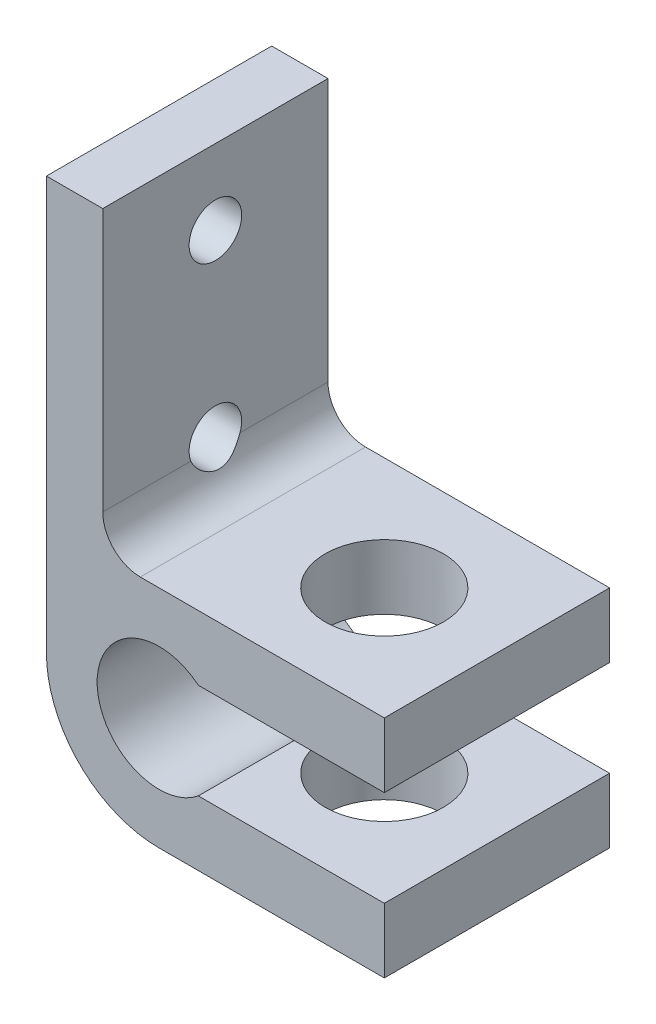
ISO-10303-21;
HEADER;
FILE_DESCRIPTION(('STEP AP214'),'2;1');
FILE_NAME('part.step','',(''),(''),'','','');
FILE_SCHEMA(('AUTOMOTIVE_DESIGN { 1 0 10303 214 1 1 1 1 }'));
ENDSEC;
DATA;
#1=APPLICATION_CONTEXT('core data for automotive mechanical design processes');
#2=APPLICATION_PROTOCOL_DEFINITION('international standard','automotive_design',2000,#1);
#3=PRODUCT_CONTEXT('',#1,'mechanical');
#4=PRODUCT('Part','Part','',(#3));
#5=PRODUCT_RELATED_PRODUCT_CATEGORY('part','',(#4));
#6=PRODUCT_DEFINITION_FORMATION('','',#4);
#7=PRODUCT_DEFINITION_CONTEXT('part definition',#1,'design');
#8=PRODUCT_DEFINITION('design','',#6,#7);
#9=PRODUCT_DEFINITION_SHAPE('','',#8);
#10=(LENGTH_UNIT() NAMED_UNIT(*) SI_UNIT(.MILLI.,.METRE.));
#11=(NAMED_UNIT(*) PLANE_ANGLE_UNIT() SI_UNIT($,.RADIAN.));
#12=(NAMED_UNIT(*) SI_UNIT($,.STERADIAN.) SOLID_ANGLE_UNIT());
#13=UNCERTAINTY_MEASURE_WITH_UNIT(LENGTH_MEASURE(1.E-05),#10,'distance_accuracy_value','');
#14=(GEOMETRIC_REPRESENTATION_CONTEXT(3) GLOBAL_UNCERTAINTY_ASSIGNED_CONTEXT((#13)) GLOBAL_UNIT_ASSIGNED_CONTEXT((#10,
#11,#12)) REPRESENTATION_CONTEXT('',''));
#15=CARTESIAN_POINT('',(0.,0.,0.));
#16=DIRECTION('',(0.,0.,1.));
#17=DIRECTION('',(1.,0.,0.));
#18=AXIS2_PLACEMENT_3D('',#15,#16,#17);
#19=CARTESIAN_POINT('',(0.,0.,12.));
#20=DIRECTION('',(0.,0.,-1.));
#21=DIRECTION('',(-1.,0.,0.));
#22=AXIS2_PLACEMENT_3D('',#19,#20,#21);
#23=CYLINDRICAL_SURFACE('',#22,3.3);
#24=CARTESIAN_POINT('',(0.,0.,0.));
#25=DIRECTION('',(0.,0.,-1.));
#26=DIRECTION('',(1.,0.,0.));
#27=AXIS2_PLACEMENT_3D('',#24,#25,#26);
#28=CIRCLE('',#27,3.3);
#29=CARTESIAN_POINT('',(2.09133180710731,-2.55271057360235,0.));
#30=VERTEX_POINT('',#29);
#31=CARTESIAN_POINT('',(2.09133180710731,2.55271057360235,0.));
#32=VERTEX_POINT('',#31);
#33=EDGE_CURVE('E161',#30,#32,#28,.T.);
#34=ORIENTED_EDGE('',*,*,#33,.T.);
#35=DIRECTION('',(0.,0.,-1.));
#36=VECTOR('',#35,1.);
#37=CARTESIAN_POINT('',(2.09133180710731,2.55271057360235,12.));
#38=LINE('',#37,#36);
#39=CARTESIAN_POINT('',(2.09133180710731,2.55271057360235,12.));
#40=VERTEX_POINT('',#39);
#41=EDGE_CURVE('E11',#40,#32,#38,.T.);
#42=ORIENTED_EDGE('',*,*,#41,.F.);
#43=CARTESIAN_POINT('',(0.,0.,12.));
#44=DIRECTION('',(0.,0.,-1.));
#45=DIRECTION('',(1.,0.,0.));
#46=AXIS2_PLACEMENT_3D('',#43,#44,#45);
#47=CIRCLE('',#46,3.3);
#48=CARTESIAN_POINT('',(2.09133180710731,-2.55271057360235,12.));
#49=VERTEX_POINT('',#48);
#50=EDGE_CURVE('E186',#49,#40,#47,.T.);
#51=ORIENTED_EDGE('',*,*,#50,.F.);
#52=DIRECTION('',(0.,0.,-1.));
#53=VECTOR('',#52,1.);
#54=CARTESIAN_POINT('',(2.09133180710731,-2.55271057360235,12.));
#55=LINE('',#54,#53);
#56=EDGE_CURVE('E157',#49,#30,#55,.T.);
#57=ORIENTED_EDGE('',*,*,#56,.T.);
#58=EDGE_LOOP('',(#34,#42,#51,#57));
#59=FACE_BOUND('',#58,.T.);
#60=ADVANCED_FACE('F31',(#59),#23,.F.);
#61=CARTESIAN_POINT('',(12.,2.55271057360236,12.));
#62=DIRECTION('',(0.,1.,0.));
#63=DIRECTION('',(-1.,0.,0.));
#64=AXIS2_PLACEMENT_3D('',#61,#62,#63);
#65=PLANE('',#64);
#66=CARTESIAN_POINT('',(6.,2.55271057360235,6.));
#67=DIRECTION('',(0.,1.,0.));
#68=DIRECTION('',(-1.,0.,0.));
#69=AXIS2_PLACEMENT_3D('',#66,#67,#68);
#70=CIRCLE('',#69,3.15);
#71=CARTESIAN_POINT('',(2.85,2.55271057360235,6.));
#72=VERTEX_POINT('',#71);
#73=EDGE_CURVE('E165',#72,#72,#70,.T.);
#74=ORIENTED_EDGE('',*,*,#73,.T.);
#75=EDGE_LOOP('',(#74));
#76=FACE_BOUND('',#75,.T.);
#77=DIRECTION('',(1.,0.,0.));
#78=VECTOR('',#77,1.);
#79=CARTESIAN_POINT('',(12.,2.55271057360236,0.));
#80=LINE('',#79,#78);
#81=CARTESIAN_POINT('',(12.,2.55271057360236,0.));
#82=VERTEX_POINT('',#81);
#83=EDGE_CURVE('E164',#32,#82,#80,.T.);
#84=ORIENTED_EDGE('',*,*,#83,.T.);
#85=DIRECTION('',(0.,0.,-1.));
#86=VECTOR('',#85,1.);
#87=CARTESIAN_POINT('',(12.,2.55271057360236,12.));
#88=LINE('',#87,#86);
#89=CARTESIAN_POINT('',(12.,2.55271057360236,12.));
#90=VERTEX_POINT('',#89);
#91=EDGE_CURVE('E39',#90,#82,#88,.T.);
#92=ORIENTED_EDGE('',*,*,#91,.F.);
#93=DIRECTION('',(1.,0.,0.));
#94=VECTOR('',#93,1.);
#95=CARTESIAN_POINT('',(12.,2.55271057360236,12.));
#96=LINE('',#95,#94);
#97=EDGE_CURVE('E107',#40,#90,#96,.T.);
#98=ORIENTED_EDGE('',*,*,#97,.F.);
#99=ORIENTED_EDGE('',*,*,#41,.T.);
#100=EDGE_LOOP('',(#84,#92,#98,#99));
#101=FACE_BOUND('',#100,.T.);
#102=ADVANCED_FACE('F328',(#76,#101),#65,.F.);
#103=CARTESIAN_POINT('',(12.,6.,12.));
#104=DIRECTION('',(-1.,0.,0.));
#105=DIRECTION('',(0.,0.,1.));
#106=AXIS2_PLACEMENT_3D('',#103,#104,#105);
#107=PLANE('',#106);
#108=DIRECTION('',(0.,1.,0.));
#109=VECTOR('',#108,1.);
#110=CARTESIAN_POINT('',(12.,6.,0.));
#111=LINE('',#110,#109);
#112=CARTESIAN_POINT('',(12.,6.,0.));
#113=VERTEX_POINT('',#112);
#114=EDGE_CURVE('E167',#82,#113,#111,.T.);
#115=ORIENTED_EDGE('',*,*,#114,.T.);
#116=DIRECTION('',(0.,0.,-1.));
#117=VECTOR('',#116,1.);
#118=CARTESIAN_POINT('',(12.,6.,12.));
#119=LINE('',#118,#117);
#120=CARTESIAN_POINT('',(12.,6.,12.));
#121=VERTEX_POINT('',#120);
#122=EDGE_CURVE('E206',#121,#113,#119,.T.);
#123=ORIENTED_EDGE('',*,*,#122,.F.);
#124=DIRECTION('',(0.,1.,0.));
#125=VECTOR('',#124,1.);
#126=CARTESIAN_POINT('',(12.,6.,12.));
#127=LINE('',#126,#125);
#128=EDGE_CURVE('E215',#90,#121,#127,.T.);
#129=ORIENTED_EDGE('',*,*,#128,.F.);
#130=ORIENTED_EDGE('',*,*,#91,.T.);
#131=EDGE_LOOP('',(#115,#123,#129,#130));
#132=FACE_BOUND('',#131,.T.);
#133=ADVANCED_FACE('F213',(#132),#107,.F.);
#134=CARTESIAN_POINT('',(-0.999999999999998,6.,12.));
#135=DIRECTION('',(0.,-1.,0.));
#136=DIRECTION('',(1.,0.,0.));
#137=AXIS2_PLACEMENT_3D('',#134,#135,#136);
#138=PLANE('',#137);
#139=CARTESIAN_POINT('',(6.,6.,6.));
#140=DIRECTION('',(0.,-1.,0.));
#141=DIRECTION('',(1.,0.,0.));
#142=AXIS2_PLACEMENT_3D('',#139,#140,#141);
#143=CIRCLE('',#142,3.15);
#144=CARTESIAN_POINT('',(9.15,6.,6.));
#145=VERTEX_POINT('',#144);
#146=EDGE_CURVE('E262',#145,#145,#143,.T.);
#147=ORIENTED_EDGE('',*,*,#146,.T.);
#148=EDGE_LOOP('',(#147));
#149=FACE_BOUND('',#148,.T.);
#150=DIRECTION('',(-1.,0.,0.));
#151=VECTOR('',#150,1.);
#152=CARTESIAN_POINT('',(-0.999999999999998,6.,0.));
#153=LINE('',#152,#151);
#154=CARTESIAN_POINT('',(-0.999999999999999,6.,0.));
#155=VERTEX_POINT('',#154);
#156=EDGE_CURVE('E169',#113,#155,#153,.T.);
#157=ORIENTED_EDGE('',*,*,#156,.T.);
#158=DIRECTION('',(0.,0.,-1.));
#159=VECTOR('',#158,1.);
#160=CARTESIAN_POINT('',(-0.999999999999999,6.,12.));
#161=LINE('',#160,#159);
#162=CARTESIAN_POINT('',(-0.999999999999999,6.,12.));
#163=VERTEX_POINT('',#162);
#164=EDGE_CURVE('E203',#163,#155,#161,.T.);
#165=ORIENTED_EDGE('',*,*,#164,.F.);
#166=DIRECTION('',(-1.,0.,0.));
#167=VECTOR('',#166,1.);
#168=CARTESIAN_POINT('',(-0.999999999999998,6.,12.));
#169=LINE('',#168,#167);
#170=EDGE_CURVE('E234',#121,#163,#169,.T.);
#171=ORIENTED_EDGE('',*,*,#170,.F.);
#172=ORIENTED_EDGE('',*,*,#122,.T.);
#173=EDGE_LOOP('',(#157,#165,#171,#172));
#174=FACE_BOUND('',#173,.T.);
#175=ADVANCED_FACE('F224',(#149,#174),#138,.F.);
#176=CARTESIAN_POINT('',(-0.999999999999998,8.,12.));
#177=DIRECTION('',(0.,0.,-1.));
#178=DIRECTION('',(-1.,0.,0.));
#179=AXIS2_PLACEMENT_3D('',#176,#177,#178);
#180=CYLINDRICAL_SURFACE('',#179,2.);
#181=DIRECTION('',(0.,0.,-1.));
#182=VECTOR('',#181,1.);
#183=CARTESIAN_POINT('',(-3.,8.,12.));
#184=LINE('',#183,#182);
#185=CARTESIAN_POINT('',(-3.,8.,4.6923303169378));
#186=VERTEX_POINT('',#185);
#187=CARTESIAN_POINT('',(-3.,8.,0.));
#188=VERTEX_POINT('',#187);
#189=EDGE_CURVE('E199',#186,#188,#184,.T.);
#190=ORIENTED_EDGE('',*,*,#189,.F.);
#191=CARTESIAN_POINT('',(-3.,8.,7.3076696830622));
#192=CARTESIAN_POINT('',(-3.00000368626239,7.96493879585205,7.29426672158299));
#193=CARTESIAN_POINT('',(-2.99907757713619,7.93044508794234,7.27945775804309));
#194=CARTESIAN_POINT('',(-2.99557798588428,7.86284995568559,7.2471730323225));
#195=CARTESIAN_POINT('',(-2.99300589707016,7.82974737898662,7.22969953517299));
#196=CARTESIAN_POINT('',(-2.98317564096547,7.73321480469394,7.17368878654337));
#197=CARTESIAN_POINT('',(-2.97379831824372,7.67213074660334,7.13139587112057));
#198=CARTESIAN_POINT('',(-2.95141616063608,7.55800481780882,7.03829992408353));
#199=CARTESIAN_POINT('',(-2.93842158046107,7.50494085733303,6.9875211097939));
#200=CARTESIAN_POINT('',(-2.91087994302873,7.40745729032855,6.87846884707918));
#201=CARTESIAN_POINT('',(-2.89633019489452,7.36305305502016,6.82018237136639));
#202=CARTESIAN_POINT('',(-2.86670218646075,7.2806286863618,6.69236459575695));
#203=CARTESIAN_POINT('',(-2.85167462381524,7.24340242022773,6.62230689286126));
#204=CARTESIAN_POINT('',(-2.82500760353883,7.1811586585015,6.47638067694068));
#205=CARTESIAN_POINT('',(-2.81336560605945,7.15613200119013,6.4005165741272));
#206=CARTESIAN_POINT('',(-2.79595291659767,7.11968134599892,6.24663897729487));
#207=CARTESIAN_POINT('',(-2.79006133620561,7.10797637355411,6.1687068005077));
#208=CARTESIAN_POINT('',(-2.78498144090085,7.09784717637925,6.01178690043574));
#209=CARTESIAN_POINT('',(-2.78578898192442,7.09941474129526,5.93279985987864));
#210=CARTESIAN_POINT('',(-2.79351654379434,7.1149270464979,5.78407009033757));
#211=CARTESIAN_POINT('',(-2.79984460729438,7.12767374943189,5.71416570552736));
#212=CARTESIAN_POINT('',(-2.81671909312502,7.16338885916504,5.57755595111776));
#213=CARTESIAN_POINT('',(-2.82726703375,7.18636094535029,5.51085174261311));
#214=CARTESIAN_POINT('',(-2.85146909517369,7.24300166795964,5.37926862419874));
#215=CARTESIAN_POINT('',(-2.8652372017211,7.27708747588446,5.31459127405056));
#216=CARTESIAN_POINT('',(-2.89352893016537,7.35481999763979,5.19137465916636));
#217=CARTESIAN_POINT('',(-2.90805327032684,7.39847593223179,5.13284139521294));
#218=CARTESIAN_POINT('',(-2.937045702688,7.49914624997917,5.01781917205902));
#219=CARTESIAN_POINT('',(-2.95137596735889,7.55703819461445,4.96205923633939));
#220=CARTESIAN_POINT('',(-2.97557920212588,7.68202604461693,4.86099211838786));
#221=CARTESIAN_POINT('',(-2.9854635984468,7.74909777116661,4.81565828867524));
#222=CARTESIAN_POINT('',(-2.99448188763658,7.8486959988481,4.76027972300955));
#223=CARTESIAN_POINT('',(-2.99651761517117,7.87824657070997,4.74519918785214));
#224=CARTESIAN_POINT('',(-2.99927710982096,7.93838352846184,4.71715708640639));
#225=CARTESIAN_POINT('',(-3.00000128420065,7.96896958980457,4.70419486347597));
#226=CARTESIAN_POINT('',(-3.,8.,4.6923303169378));
#227=B_SPLINE_CURVE_WITH_KNOTS('',3,(#191,#192,#193,#194,#195,#196,#197,#198,#199,#200,#201,
#202,#203,#204,#205,#206,#207,#208,#209,#210,#211,#212,#213,#214,#215,#216,#217,#218,#219,#220,
#221,#222,#223,#224,#225,#226),.UNSPECIFIED.,.F.,.F.,(4,2,2,2,2,2,2,2,2,2,2,2,2,2,2,2,2,4),(0.,
0.112515520213301,0.224935922496968,0.448416625169151,0.671270114793604,0.894515644524399,
1.13560346653734,1.3765099552884,1.61223530135837,1.84781483905723,2.06086455755929,
2.27399099950884,2.4962744309904,2.71877298001379,2.96251937283283,3.20563568809973,
3.3052591882948,3.40485174801758),.UNSPECIFIED.);
#228=CARTESIAN_POINT('',(-3.,8.,7.3076696830622));
#229=VERTEX_POINT('',#228);
#230=EDGE_CURVE('E45',#229,#186,#227,.T.);
#231=ORIENTED_EDGE('',*,*,#230,.F.);
#232=CARTESIAN_POINT('',(-3.,8.,12.));
#233=VERTEX_POINT('',#232);
#234=EDGE_CURVE('E200',#233,#229,#184,.T.);
#235=ORIENTED_EDGE('',*,*,#234,.F.);
#236=CARTESIAN_POINT('',(-0.999999999999998,8.,12.));
#237=DIRECTION('',(0.,0.,-1.));
#238=DIRECTION('',(1.,0.,0.));
#239=AXIS2_PLACEMENT_3D('',#236,#237,#238);
#240=CIRCLE('',#239,2.);
#241=EDGE_CURVE('E231',#163,#233,#240,.T.);
#242=ORIENTED_EDGE('',*,*,#241,.F.);
#243=ORIENTED_EDGE('',*,*,#164,.T.);
#244=CARTESIAN_POINT('',(-0.999999999999998,8.,0.));
#245=DIRECTION('',(0.,0.,-1.));
#246=DIRECTION('',(1.,0.,0.));
#247=AXIS2_PLACEMENT_3D('',#244,#245,#246);
#248=CIRCLE('',#247,2.);
#249=EDGE_CURVE('E171',#155,#188,#248,.T.);
#250=ORIENTED_EDGE('',*,*,#249,.T.);
#251=EDGE_LOOP('',(#190,#231,#235,#242,#243,#250));
#252=FACE_BOUND('',#251,.T.);
#253=ADVANCED_FACE('F229',(#252),#180,.F.);
#254=CARTESIAN_POINT('',(-3.,22.,12.));
#255=DIRECTION('',(-1.,0.,0.));
#256=DIRECTION('',(0.,-1.,0.));
#257=AXIS2_PLACEMENT_3D('',#254,#255,#256);
#258=PLANE('',#257);
#259=CARTESIAN_POINT('',(-3.,18.,6.));
#260=DIRECTION('',(-1.,0.,0.));
#261=DIRECTION('',(0.,-1.,0.));
#262=AXIS2_PLACEMENT_3D('',#259,#260,#261);
#263=CIRCLE('',#262,1.4);
#264=CARTESIAN_POINT('',(-3.,16.6,6.));
#265=VERTEX_POINT('',#264);
#266=EDGE_CURVE('E268',#265,#265,#263,.F.);
#267=ORIENTED_EDGE('',*,*,#266,.F.);
#268=EDGE_LOOP('',(#267));
#269=FACE_BOUND('',#268,.T.);
#270=ORIENTED_EDGE('',*,*,#234,.T.);
#271=CARTESIAN_POINT('',(-3.,8.5,6.));
#272=DIRECTION('',(-1.,0.,0.));
#273=DIRECTION('',(0.,-1.,0.));
#274=AXIS2_PLACEMENT_3D('',#271,#272,#273);
#275=CIRCLE('',#274,1.4);
#276=EDGE_CURVE('E280',#186,#229,#275,.F.);
#277=ORIENTED_EDGE('',*,*,#276,.F.);
#278=ORIENTED_EDGE('',*,*,#189,.T.);
#279=DIRECTION('',(0.,1.,0.));
#280=VECTOR('',#279,1.);
#281=CARTESIAN_POINT('',(-3.,22.,0.));
#282=LINE('',#281,#280);
#283=CARTESIAN_POINT('',(-3.,22.,0.));
#284=VERTEX_POINT('',#283);
#285=EDGE_CURVE('E174',#188,#284,#282,.T.);
#286=ORIENTED_EDGE('',*,*,#285,.T.);
#287=DIRECTION('',(0.,0.,-1.));
#288=VECTOR('',#287,1.);
#289=CARTESIAN_POINT('',(-3.,22.,12.));
#290=LINE('',#289,#288);
#291=CARTESIAN_POINT('',(-3.,22.,12.));
#292=VERTEX_POINT('',#291);
#293=EDGE_CURVE('E196',#292,#284,#290,.T.);
#294=ORIENTED_EDGE('',*,*,#293,.F.);
#295=DIRECTION('',(0.,1.,0.));
#296=VECTOR('',#295,1.);
#297=CARTESIAN_POINT('',(-3.,22.,12.));
#298=LINE('',#297,#296);
#299=EDGE_CURVE('E233',#233,#292,#298,.T.);
#300=ORIENTED_EDGE('',*,*,#299,.F.);
#301=EDGE_LOOP('',(#270,#277,#278,#286,#294,#300));
#302=FACE_BOUND('',#301,.T.);
#303=ADVANCED_FACE('F317',(#269,#302),#258,.F.);
#304=CARTESIAN_POINT('',(-6.,22.,12.));
#305=DIRECTION('',(0.,-1.,0.));
#306=DIRECTION('',(0.,0.,-1.));
#307=AXIS2_PLACEMENT_3D('',#304,#305,#306);
#308=PLANE('',#307);
#309=DIRECTION('',(-1.,0.,0.));
#310=VECTOR('',#309,1.);
#311=CARTESIAN_POINT('',(-6.,22.,0.));
#312=LINE('',#311,#310);
#313=CARTESIAN_POINT('',(-6.,22.,0.));
#314=VERTEX_POINT('',#313);
#315=EDGE_CURVE('E176',#284,#314,#312,.T.);
#316=ORIENTED_EDGE('',*,*,#315,.T.);
#317=DIRECTION('',(0.,0.,-1.));
#318=VECTOR('',#317,1.);
#319=CARTESIAN_POINT('',(-6.,22.,12.));
#320=LINE('',#319,#318);
#321=CARTESIAN_POINT('',(-6.,22.,12.));
#322=VERTEX_POINT('',#321);
#323=EDGE_CURVE('E193',#322,#314,#320,.T.);
#324=ORIENTED_EDGE('',*,*,#323,.F.);
#325=DIRECTION('',(-1.,0.,0.));
#326=VECTOR('',#325,1.);
#327=CARTESIAN_POINT('',(-6.,22.,12.));
#328=LINE('',#327,#326);
#329=EDGE_CURVE('E236',#292,#322,#328,.T.);
#330=ORIENTED_EDGE('',*,*,#329,.F.);
#331=ORIENTED_EDGE('',*,*,#293,.T.);
#332=EDGE_LOOP('',(#316,#324,#330,#331));
#333=FACE_BOUND('',#332,.T.);
#334=ADVANCED_FACE('F313',(#333),#308,.F.);
#335=CARTESIAN_POINT('',(-6.,0.,12.));
#336=DIRECTION('',(1.,0.,0.));
#337=DIRECTION('',(0.,0.,-1.));
#338=AXIS2_PLACEMENT_3D('',#335,#336,#337);
#339=PLANE('',#338);
#340=CARTESIAN_POINT('',(-6.,8.5,6.));
#341=DIRECTION('',(-1.,0.,0.));
#342=DIRECTION('',(0.,0.,1.));
#343=AXIS2_PLACEMENT_3D('',#340,#341,#342);
#344=CIRCLE('',#343,1.4);
#345=CARTESIAN_POINT('',(-6.,8.5,7.4));
#346=VERTEX_POINT('',#345);
#347=EDGE_CURVE('E452',#346,#346,#344,.T.);
#348=ORIENTED_EDGE('',*,*,#347,.F.);
#349=EDGE_LOOP('',(#348));
#350=FACE_BOUND('',#349,.T.);
#351=CARTESIAN_POINT('',(-6.,18.,6.));
#352=DIRECTION('',(-1.,0.,0.));
#353=DIRECTION('',(0.,0.,1.));
#354=AXIS2_PLACEMENT_3D('',#351,#352,#353);
#355=CIRCLE('',#354,1.4);
#356=CARTESIAN_POINT('',(-6.,18.,7.4));
#357=VERTEX_POINT('',#356);
#358=EDGE_CURVE('E271',#357,#357,#355,.T.);
#359=ORIENTED_EDGE('',*,*,#358,.F.);
#360=EDGE_LOOP('',(#359));
#361=FACE_BOUND('',#360,.T.);
#362=DIRECTION('',(0.,-1.,0.));
#363=VECTOR('',#362,1.);
#364=CARTESIAN_POINT('',(-6.,0.,0.));
#365=LINE('',#364,#363);
#366=CARTESIAN_POINT('',(-6.,0.,0.));
#367=VERTEX_POINT('',#366);
#368=EDGE_CURVE('E178',#314,#367,#365,.T.);
#369=ORIENTED_EDGE('',*,*,#368,.T.);
#370=DIRECTION('',(0.,0.,-1.));
#371=VECTOR('',#370,1.);
#372=CARTESIAN_POINT('',(-6.,0.,12.));
#373=LINE('',#372,#371);
#374=CARTESIAN_POINT('',(-6.,0.,12.));
#375=VERTEX_POINT('',#374);
#376=EDGE_CURVE('E190',#375,#367,#373,.T.);
#377=ORIENTED_EDGE('',*,*,#376,.F.);
#378=DIRECTION('',(0.,-1.,0.));
#379=VECTOR('',#378,1.);
#380=CARTESIAN_POINT('',(-6.,0.,12.));
#381=LINE('',#380,#379);
#382=EDGE_CURVE('E242',#322,#375,#381,.T.);
#383=ORIENTED_EDGE('',*,*,#382,.F.);
#384=ORIENTED_EDGE('',*,*,#323,.T.);
#385=EDGE_LOOP('',(#369,#377,#383,#384));
#386=FACE_BOUND('',#385,.T.);
#387=ADVANCED_FACE('F248',(#350,#361,#386),#339,.F.);
#388=CARTESIAN_POINT('',(0.,0.,12.));
#389=DIRECTION('',(0.,0.,-1.));
#390=DIRECTION('',(-1.,0.,0.));
#391=AXIS2_PLACEMENT_3D('',#388,#389,#390);
#392=CYLINDRICAL_SURFACE('',#391,6.);
#393=CARTESIAN_POINT('',(0.,0.,0.));
#394=DIRECTION('',(0.,0.,1.));
#395=DIRECTION('',(1.,0.,0.));
#396=AXIS2_PLACEMENT_3D('',#393,#394,#395);
#397=CIRCLE('',#396,6.);
#398=CARTESIAN_POINT('',(0.,-6.,0.));
#399=VERTEX_POINT('',#398);
#400=EDGE_CURVE('E180',#367,#399,#397,.T.);
#401=ORIENTED_EDGE('',*,*,#400,.T.);
#402=DIRECTION('',(0.,0.,-1.));
#403=VECTOR('',#402,1.);
#404=CARTESIAN_POINT('',(0.,-6.,12.));
#405=LINE('',#404,#403);
#406=CARTESIAN_POINT('',(0.,-6.,12.));
#407=VERTEX_POINT('',#406);
#408=EDGE_CURVE('E152',#407,#399,#405,.T.);
#409=ORIENTED_EDGE('',*,*,#408,.F.);
#410=CARTESIAN_POINT('',(0.,0.,12.));
#411=DIRECTION('',(0.,0.,1.));
#412=DIRECTION('',(1.,0.,0.));
#413=AXIS2_PLACEMENT_3D('',#410,#411,#412);
#414=CIRCLE('',#413,6.);
#415=EDGE_CURVE('E140',#375,#407,#414,.T.);
#416=ORIENTED_EDGE('',*,*,#415,.F.);
#417=ORIENTED_EDGE('',*,*,#376,.T.);
#418=EDGE_LOOP('',(#401,#409,#416,#417));
#419=FACE_BOUND('',#418,.T.);
#420=ADVANCED_FACE('F252',(#419),#392,.T.);
#421=CARTESIAN_POINT('',(0.,-6.,12.));
#422=DIRECTION('',(0.,1.,0.));
#423=DIRECTION('',(0.,0.,1.));
#424=AXIS2_PLACEMENT_3D('',#421,#422,#423);
#425=PLANE('',#424);
#426=CARTESIAN_POINT('',(6.,-6.,6.));
#427=DIRECTION('',(0.,1.,0.));
#428=DIRECTION('',(0.,0.,1.));
#429=AXIS2_PLACEMENT_3D('',#426,#427,#428);
#430=CIRCLE('',#429,3.15);
#431=CARTESIAN_POINT('',(6.,-6.,9.15));
#432=VERTEX_POINT('',#431);
#433=EDGE_CURVE('E265',#432,#432,#430,.T.);
#434=ORIENTED_EDGE('',*,*,#433,.T.);
#435=EDGE_LOOP('',(#434));
#436=FACE_BOUND('',#435,.T.);
#437=DIRECTION('',(1.,0.,0.));
#438=VECTOR('',#437,1.);
#439=CARTESIAN_POINT('',(0.,-6.,0.));
#440=LINE('',#439,#438);
#441=CARTESIAN_POINT('',(12.,-6.,0.));
#442=VERTEX_POINT('',#441);
#443=EDGE_CURVE('E149',#399,#442,#440,.T.);
#444=ORIENTED_EDGE('',*,*,#443,.T.);
#445=DIRECTION('',(0.,0.,-1.));
#446=VECTOR('',#445,1.);
#447=CARTESIAN_POINT('',(12.,-6.,12.));
#448=LINE('',#447,#446);
#449=CARTESIAN_POINT('',(12.,-6.,12.));
#450=VERTEX_POINT('',#449);
#451=EDGE_CURVE('E146',#450,#442,#448,.T.);
#452=ORIENTED_EDGE('',*,*,#451,.F.);
#453=DIRECTION('',(1.,0.,0.));
#454=VECTOR('',#453,1.);
#455=CARTESIAN_POINT('',(0.,-6.,12.));
#456=LINE('',#455,#454);
#457=EDGE_CURVE('E133',#407,#450,#456,.T.);
#458=ORIENTED_EDGE('',*,*,#457,.F.);
#459=ORIENTED_EDGE('',*,*,#408,.T.);
#460=EDGE_LOOP('',(#444,#452,#458,#459));
#461=FACE_BOUND('',#460,.T.);
#462=ADVANCED_FACE('F147',(#436,#461),#425,.F.);
#463=CARTESIAN_POINT('',(12.,-6.,12.));
#464=DIRECTION('',(-1.,0.,0.));
#465=DIRECTION('',(0.,0.,1.));
#466=AXIS2_PLACEMENT_3D('',#463,#464,#465);
#467=PLANE('',#466);
#468=DIRECTION('',(0.,1.,0.));
#469=VECTOR('',#468,1.);
#470=CARTESIAN_POINT('',(12.,-6.,0.));
#471=LINE('',#470,#469);
#472=CARTESIAN_POINT('',(12.,-2.55271057360236,0.));
#473=VERTEX_POINT('',#472);
#474=EDGE_CURVE('E183',#442,#473,#471,.T.);
#475=ORIENTED_EDGE('',*,*,#474,.T.);
#476=DIRECTION('',(0.,0.,-1.));
#477=VECTOR('',#476,1.);
#478=CARTESIAN_POINT('',(12.,-2.55271057360236,12.));
#479=LINE('',#478,#477);
#480=CARTESIAN_POINT('',(12.,-2.55271057360236,12.));
#481=VERTEX_POINT('',#480);
#482=EDGE_CURVE('E153',#481,#473,#479,.T.);
#483=ORIENTED_EDGE('',*,*,#482,.F.);
#484=DIRECTION('',(0.,1.,0.));
#485=VECTOR('',#484,1.);
#486=CARTESIAN_POINT('',(12.,-6.,12.));
#487=LINE('',#486,#485);
#488=EDGE_CURVE('E137',#450,#481,#487,.T.);
#489=ORIENTED_EDGE('',*,*,#488,.F.);
#490=ORIENTED_EDGE('',*,*,#451,.T.);
#491=EDGE_LOOP('',(#475,#483,#489,#490));
#492=FACE_BOUND('',#491,.T.);
#493=ADVANCED_FACE('F155',(#492),#467,.F.);
#494=CARTESIAN_POINT('',(12.,-2.55271057360236,12.));
#495=DIRECTION('',(0.,-1.,0.));
#496=DIRECTION('',(1.,0.,0.));
#497=AXIS2_PLACEMENT_3D('',#494,#495,#496);
#498=PLANE('',#497);
#499=CARTESIAN_POINT('',(6.,-2.55271057360236,6.));
#500=DIRECTION('',(0.,-1.,0.));
#501=DIRECTION('',(1.,0.,0.));
#502=AXIS2_PLACEMENT_3D('',#499,#500,#501);
#503=CIRCLE('',#502,3.15);
#504=CARTESIAN_POINT('',(9.15,-2.55271057360236,6.));
#505=VERTEX_POINT('',#504);
#506=EDGE_CURVE('E34',#505,#505,#503,.T.);
#507=ORIENTED_EDGE('',*,*,#506,.T.);
#508=EDGE_LOOP('',(#507));
#509=FACE_BOUND('',#508,.T.);
#510=DIRECTION('',(-1.,0.,0.));
#511=VECTOR('',#510,1.);
#512=CARTESIAN_POINT('',(12.,-2.55271057360236,0.));
#513=LINE('',#512,#511);
#514=EDGE_CURVE('E99',#473,#30,#513,.T.);
#515=ORIENTED_EDGE('',*,*,#514,.T.);
#516=ORIENTED_EDGE('',*,*,#56,.F.);
#517=DIRECTION('',(-1.,0.,0.));
#518=VECTOR('',#517,1.);
#519=CARTESIAN_POINT('',(12.,-2.55271057360236,12.));
#520=LINE('',#519,#518);
#521=EDGE_CURVE('E54',#481,#49,#520,.T.);
#522=ORIENTED_EDGE('',*,*,#521,.F.);
#523=ORIENTED_EDGE('',*,*,#482,.T.);
#524=EDGE_LOOP('',(#515,#516,#522,#523));
#525=FACE_BOUND('',#524,.T.);
#526=ADVANCED_FACE('F253',(#509,#525),#498,.F.);
#527=CARTESIAN_POINT('',(0.,0.,12.));
#528=DIRECTION('',(0.,0.,1.));
#529=DIRECTION('',(1.,0.,0.));
#530=AXIS2_PLACEMENT_3D('',#527,#528,#529);
#531=PLANE('',#530);
#532=ORIENTED_EDGE('',*,*,#50,.T.);
#533=ORIENTED_EDGE('',*,*,#97,.T.);
#534=ORIENTED_EDGE('',*,*,#128,.T.);
#535=ORIENTED_EDGE('',*,*,#170,.T.);
#536=ORIENTED_EDGE('',*,*,#241,.T.);
#537=ORIENTED_EDGE('',*,*,#299,.T.);
#538=ORIENTED_EDGE('',*,*,#329,.T.);
#539=ORIENTED_EDGE('',*,*,#382,.T.);
#540=ORIENTED_EDGE('',*,*,#415,.T.);
#541=ORIENTED_EDGE('',*,*,#457,.T.);
#542=ORIENTED_EDGE('',*,*,#488,.T.);
#543=ORIENTED_EDGE('',*,*,#521,.T.);
#544=EDGE_LOOP('',(#532,#533,#534,#535,#536,#537,#538,#539,#540,#541,#542,#543));
#545=FACE_BOUND('',#544,.T.);
#546=ADVANCED_FACE('F135',(#545),#531,.T.);
#547=CARTESIAN_POINT('',(0.,0.,0.));
#548=DIRECTION('',(0.,0.,1.));
#549=DIRECTION('',(1.,0.,0.));
#550=AXIS2_PLACEMENT_3D('',#547,#548,#549);
#551=PLANE('',#550);
#552=ORIENTED_EDGE('',*,*,#33,.F.);
#553=ORIENTED_EDGE('',*,*,#514,.F.);
#554=ORIENTED_EDGE('',*,*,#474,.F.);
#555=ORIENTED_EDGE('',*,*,#443,.F.);
#556=ORIENTED_EDGE('',*,*,#400,.F.);
#557=ORIENTED_EDGE('',*,*,#368,.F.);
#558=ORIENTED_EDGE('',*,*,#315,.F.);
#559=ORIENTED_EDGE('',*,*,#285,.F.);
#560=ORIENTED_EDGE('',*,*,#249,.F.);
#561=ORIENTED_EDGE('',*,*,#156,.F.);
#562=ORIENTED_EDGE('',*,*,#114,.F.);
#563=ORIENTED_EDGE('',*,*,#83,.F.);
#564=EDGE_LOOP('',(#552,#553,#554,#555,#556,#557,#558,#559,#560,#561,#562,#563));
#565=FACE_BOUND('',#564,.T.);
#566=ADVANCED_FACE('F219',(#565),#551,.F.);
#567=CARTESIAN_POINT('',(6.,-6.,6.));
#568=DIRECTION('',(0.,1.,0.));
#569=DIRECTION('',(0.,0.,1.));
#570=AXIS2_PLACEMENT_3D('',#567,#568,#569);
#571=CYLINDRICAL_SURFACE('',#570,3.15);
#572=ORIENTED_EDGE('',*,*,#433,.F.);
#573=EDGE_LOOP('',(#572));
#574=FACE_BOUND('',#573,.T.);
#575=ORIENTED_EDGE('',*,*,#506,.F.);
#576=EDGE_LOOP('',(#575));
#577=FACE_BOUND('',#576,.T.);
#578=ADVANCED_FACE('F295',(#574,#577),#571,.F.);
#579=ORIENTED_EDGE('',*,*,#146,.F.);
#580=EDGE_LOOP('',(#579));
#581=FACE_BOUND('',#580,.T.);
#582=ORIENTED_EDGE('',*,*,#73,.F.);
#583=EDGE_LOOP('',(#582));
#584=FACE_BOUND('',#583,.T.);
#585=ADVANCED_FACE('F291',(#581,#584),#571,.F.);
#586=CARTESIAN_POINT('',(12.001,18.,6.));
#587=DIRECTION('',(-1.,0.,0.));
#588=DIRECTION('',(0.,0.,1.));
#589=AXIS2_PLACEMENT_3D('',#586,#587,#588);
#590=CYLINDRICAL_SURFACE('',#589,1.4);
#591=ORIENTED_EDGE('',*,*,#358,.T.);
#592=EDGE_LOOP('',(#591));
#593=FACE_BOUND('',#592,.T.);
#594=ORIENTED_EDGE('',*,*,#266,.T.);
#595=EDGE_LOOP('',(#594));
#596=FACE_BOUND('',#595,.T.);
#597=ADVANCED_FACE('F287',(#593,#596),#590,.F.);
#598=CARTESIAN_POINT('',(12.001,8.5,6.));
#599=DIRECTION('',(-1.,0.,0.));
#600=DIRECTION('',(0.,0.,1.));
#601=AXIS2_PLACEMENT_3D('',#598,#599,#600);
#602=CYLINDRICAL_SURFACE('',#601,1.4);
#603=ORIENTED_EDGE('',*,*,#347,.T.);
#604=EDGE_LOOP('',(#603));
#605=FACE_BOUND('',#604,.T.);
#606=ORIENTED_EDGE('',*,*,#230,.T.);
#607=ORIENTED_EDGE('',*,*,#276,.T.);
#608=EDGE_LOOP('',(#606,#607));
#609=FACE_BOUND('',#608,.T.);
#610=ADVANCED_FACE('F282',(#605,#609),#602,.F.);
#611=CLOSED_SHELL('',(#60,#102,#133,#175,#253,#303,#334,#387,#420,#462,#493,#526,#546,#566,#578,
#585,#597,#610));
#612=MANIFOLD_SOLID_BREP('B2',#611);
#613=ADVANCED_BREP_SHAPE_REPRESENTATION('',(#18,#612),#14);
#614=SHAPE_DEFINITION_REPRESENTATION(#9,#613);
ENDSEC;
END-ISO-10303-21;
